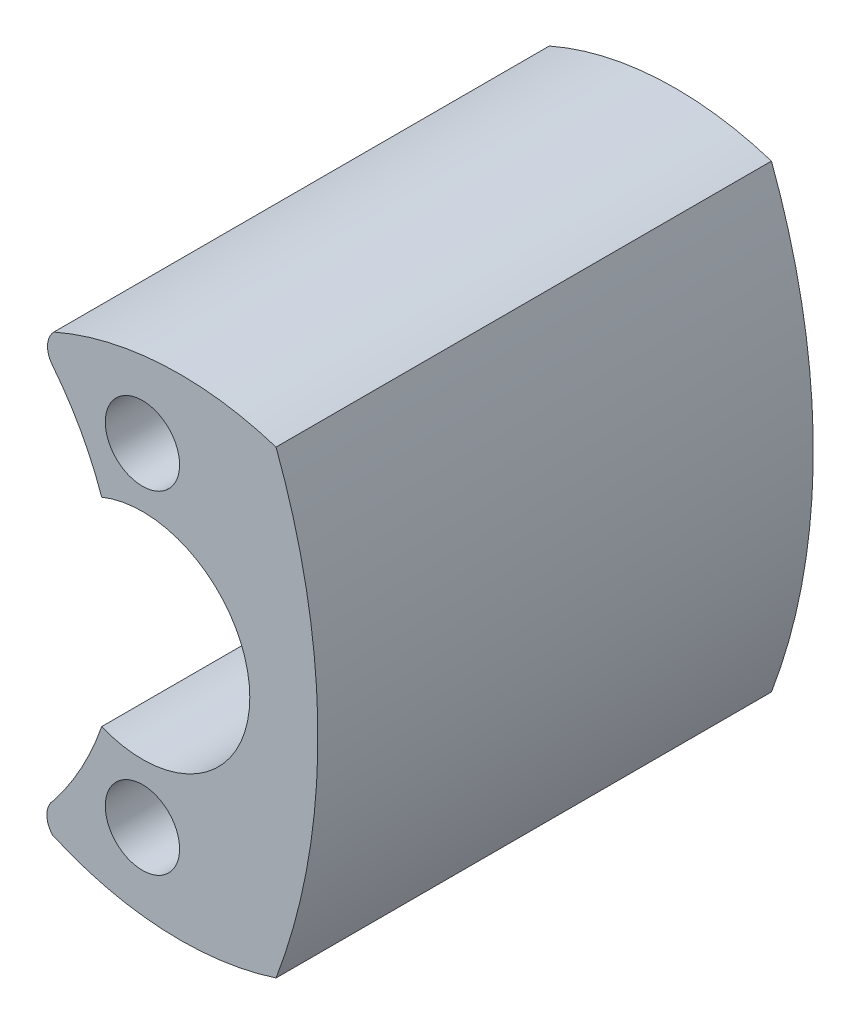
ISO-10303-21;
HEADER;
FILE_DESCRIPTION(('STEP AP214'),'2;1');
FILE_NAME('part.step','',(''),(''),'','','');
FILE_SCHEMA(('AUTOMOTIVE_DESIGN { 1 0 10303 214 1 1 1 1 }'));
ENDSEC;
DATA;
#1=APPLICATION_CONTEXT('core data for automotive mechanical design processes');
#2=APPLICATION_PROTOCOL_DEFINITION('international standard','automotive_design',2000,#1);
#3=PRODUCT_CONTEXT('',#1,'mechanical');
#4=PRODUCT('Part','Part','',(#3));
#5=PRODUCT_RELATED_PRODUCT_CATEGORY('part','',(#4));
#6=PRODUCT_DEFINITION_FORMATION('','',#4);
#7=PRODUCT_DEFINITION_CONTEXT('part definition',#1,'design');
#8=PRODUCT_DEFINITION('design','',#6,#7);
#9=PRODUCT_DEFINITION_SHAPE('','',#8);
#10=(LENGTH_UNIT() NAMED_UNIT(*) SI_UNIT(.MILLI.,.METRE.));
#11=(NAMED_UNIT(*) PLANE_ANGLE_UNIT() SI_UNIT($,.RADIAN.));
#12=(NAMED_UNIT(*) SI_UNIT($,.STERADIAN.) SOLID_ANGLE_UNIT());
#13=UNCERTAINTY_MEASURE_WITH_UNIT(LENGTH_MEASURE(1.E-05),#10,'distance_accuracy_value','');
#14=(GEOMETRIC_REPRESENTATION_CONTEXT(3) GLOBAL_UNCERTAINTY_ASSIGNED_CONTEXT((#13)) GLOBAL_UNIT_ASSIGNED_CONTEXT((#10,
#11,#12)) REPRESENTATION_CONTEXT('',''));
#15=CARTESIAN_POINT('',(0.,0.,0.));
#16=DIRECTION('',(0.,0.,1.));
#17=DIRECTION('',(1.,0.,0.));
#18=AXIS2_PLACEMENT_3D('',#15,#16,#17);
#19=CARTESIAN_POINT('',(-13.2313355478784,0.,20.));
#20=DIRECTION('',(0.,0.,-1.));
#21=DIRECTION('',(-1.,0.,0.));
#22=AXIS2_PLACEMENT_3D('',#19,#20,#21);
#23=CYLINDRICAL_SURFACE('',#22,12.2604861513936);
#24=CARTESIAN_POINT('',(-13.2313355478784,0.,20.));
#25=DIRECTION('',(0.,0.,-1.));
#26=DIRECTION('',(-1.,0.,0.));
#27=AXIS2_PLACEMENT_3D('',#24,#25,#26);
#28=CIRCLE('',#27,12.2604861513936);
#29=CARTESIAN_POINT('',(-1.64537225114125,-4.01060782864323,20.));
#30=VERTEX_POINT('',#29);
#31=CARTESIAN_POINT('',(-3.57576767996249,-7.55576136577806,20.));
#32=VERTEX_POINT('',#31);
#33=EDGE_CURVE('E125',#30,#32,#28,.T.);
#34=ORIENTED_EDGE('',*,*,#33,.F.);
#35=DIRECTION('',(0.,0.,-1.));
#36=VECTOR('',#35,1.);
#37=CARTESIAN_POINT('',(-1.64537225114125,-4.01060782864323,11.999));
#38=LINE('',#37,#36);
#39=CARTESIAN_POINT('',(-1.64537225114125,-4.01060782864323,-0.001));
#40=VERTEX_POINT('',#39);
#41=EDGE_CURVE('E112',#30,#40,#38,.T.);
#42=ORIENTED_EDGE('',*,*,#41,.T.);
#43=CARTESIAN_POINT('',(-13.2313355478784,0.,-0.001));
#44=DIRECTION('',(0.,0.,-1.));
#45=DIRECTION('',(-1.,0.,0.));
#46=AXIS2_PLACEMENT_3D('',#43,#44,#45);
#47=CIRCLE('',#46,12.2604861513936);
#48=CARTESIAN_POINT('',(-3.57576767996249,-7.55576136577806,-0.001));
#49=VERTEX_POINT('',#48);
#50=EDGE_CURVE('E123',#40,#49,#47,.T.);
#51=ORIENTED_EDGE('',*,*,#50,.T.);
#52=DIRECTION('',(0.,0.,-1.));
#53=VECTOR('',#52,1.);
#54=CARTESIAN_POINT('',(-3.57576767996249,-7.55576136577806,20.));
#55=LINE('',#54,#53);
#56=EDGE_CURVE('E167',#32,#49,#55,.T.);
#57=ORIENTED_EDGE('',*,*,#56,.F.);
#58=EDGE_LOOP('',(#34,#42,#51,#57));
#59=FACE_BOUND('',#58,.T.);
#60=ADVANCED_FACE('F47',(#59),#23,.F.);
#61=CARTESIAN_POINT('',(1.51645658150854,-2.74018411875687,20.));
#62=DIRECTION('',(0.,0.,-1.));
#63=DIRECTION('',(-1.,0.,0.));
#64=AXIS2_PLACEMENT_3D('',#61,#62,#63);
#65=CYLINDRICAL_SURFACE('',#64,12.6318125052895);
#66=DIRECTION('',(0.,0.,-1.));
#67=VECTOR('',#66,1.);
#68=CARTESIAN_POINT('',(5.39429470920508,9.28167341758802,20.));
#69=LINE('',#68,#67);
#70=CARTESIAN_POINT('',(5.39429470920508,9.28167341758802,20.));
#71=VERTEX_POINT('',#70);
#72=CARTESIAN_POINT('',(5.39429470920508,9.28167341758802,-0.001));
#73=VERTEX_POINT('',#72);
#74=EDGE_CURVE('E161',#71,#73,#69,.T.);
#75=ORIENTED_EDGE('',*,*,#74,.T.);
#76=CARTESIAN_POINT('',(1.51645658150854,-2.74018411875687,-0.001));
#77=DIRECTION('',(0.,0.,1.));
#78=DIRECTION('',(-1.,0.,0.));
#79=AXIS2_PLACEMENT_3D('',#76,#77,#78);
#80=CIRCLE('',#79,12.6318125052895);
#81=CARTESIAN_POINT('',(-3.57576767996249,8.81974404882597,-0.001));
#82=VERTEX_POINT('',#81);
#83=EDGE_CURVE('E138',#73,#82,#80,.T.);
#84=ORIENTED_EDGE('',*,*,#83,.T.);
#85=DIRECTION('',(0.,0.,-1.));
#86=VECTOR('',#85,1.);
#87=CARTESIAN_POINT('',(-3.57576767996249,8.81974404882597,20.));
#88=LINE('',#87,#86);
#89=CARTESIAN_POINT('',(-3.57576767996249,8.81974404882597,20.));
#90=VERTEX_POINT('',#89);
#91=EDGE_CURVE('E11',#90,#82,#88,.T.);
#92=ORIENTED_EDGE('',*,*,#91,.F.);
#93=CARTESIAN_POINT('',(1.51645658150854,-2.74018411875687,20.));
#94=DIRECTION('',(0.,0.,1.));
#95=DIRECTION('',(-1.,0.,0.));
#96=AXIS2_PLACEMENT_3D('',#93,#94,#95);
#97=CIRCLE('',#96,12.6318125052895);
#98=EDGE_CURVE('E149',#71,#90,#97,.T.);
#99=ORIENTED_EDGE('',*,*,#98,.F.);
#100=EDGE_LOOP('',(#75,#84,#92,#99));
#101=FACE_BOUND('',#100,.T.);
#102=ADVANCED_FACE('F49',(#101),#65,.T.);
#103=CARTESIAN_POINT('',(-2.93942531431104,8.19213389498871,20.));
#104=DIRECTION('',(0.,0.,-1.));
#105=DIRECTION('',(-1.,0.,0.));
#106=AXIS2_PLACEMENT_3D('',#103,#104,#105);
#107=CYLINDRICAL_SURFACE('',#106,0.893770726485547);
#108=ORIENTED_EDGE('',*,*,#91,.T.);
#109=CARTESIAN_POINT('',(-2.93942531431104,8.19213389498871,-0.001));
#110=DIRECTION('',(0.,0.,1.));
#111=DIRECTION('',(-1.,0.,0.));
#112=AXIS2_PLACEMENT_3D('',#109,#110,#111);
#113=CIRCLE('',#112,0.893770726485547);
#114=CARTESIAN_POINT('',(-3.63871286599695,7.63551640372596,-0.001));
#115=VERTEX_POINT('',#114);
#116=EDGE_CURVE('E135',#82,#115,#113,.T.);
#117=ORIENTED_EDGE('',*,*,#116,.T.);
#118=DIRECTION('',(0.,0.,-1.));
#119=VECTOR('',#118,1.);
#120=CARTESIAN_POINT('',(-3.63871286599695,7.63551640372596,20.));
#121=LINE('',#120,#119);
#122=CARTESIAN_POINT('',(-3.63871286599695,7.63551640372596,20.));
#123=VERTEX_POINT('',#122);
#124=EDGE_CURVE('E55',#123,#115,#121,.T.);
#125=ORIENTED_EDGE('',*,*,#124,.F.);
#126=CARTESIAN_POINT('',(-2.93942531431104,8.19213389498871,20.));
#127=DIRECTION('',(0.,0.,1.));
#128=DIRECTION('',(-1.,0.,0.));
#129=AXIS2_PLACEMENT_3D('',#126,#127,#128);
#130=CIRCLE('',#129,0.893770726485547);
#131=EDGE_CURVE('E151',#90,#123,#130,.T.);
#132=ORIENTED_EDGE('',*,*,#131,.F.);
#133=EDGE_LOOP('',(#108,#117,#125,#132));
#134=FACE_BOUND('',#133,.T.);
#135=ADVANCED_FACE('F176',(#134),#107,.T.);
#136=CARTESIAN_POINT('',(-1.64537225114125,4.01060782864323,-0.00100000000000088));
#137=VERTEX_POINT('',#136);
#138=EDGE_CURVE('E134',#115,#137,#47,.T.);
#139=ORIENTED_EDGE('',*,*,#138,.T.);
#140=DIRECTION('',(0.,0.,-1.));
#141=VECTOR('',#140,1.);
#142=CARTESIAN_POINT('',(-1.64537225114125,4.01060782864323,11.999));
#143=LINE('',#142,#141);
#144=CARTESIAN_POINT('',(-1.64537225114125,4.01060782864323,20.));
#145=VERTEX_POINT('',#144);
#146=EDGE_CURVE('E62',#137,#145,#143,.F.);
#147=ORIENTED_EDGE('',*,*,#146,.T.);
#148=EDGE_CURVE('E153',#123,#145,#28,.T.);
#149=ORIENTED_EDGE('',*,*,#148,.F.);
#150=ORIENTED_EDGE('',*,*,#124,.T.);
#151=EDGE_LOOP('',(#139,#147,#149,#150));
#152=FACE_BOUND('',#151,.T.);
#153=ADVANCED_FACE('F171',(#152),#23,.F.);
#154=CARTESIAN_POINT('',(-2.97974763085371,-8.20163469798779,20.));
#155=DIRECTION('',(0.,0.,-1.));
#156=DIRECTION('',(-1.,0.,0.));
#157=AXIS2_PLACEMENT_3D('',#154,#155,#156);
#158=CYLINDRICAL_SURFACE('',#157,0.878858498393984);
#159=ORIENTED_EDGE('',*,*,#56,.T.);
#160=CARTESIAN_POINT('',(-2.97974763085371,-8.20163469798779,-0.001));
#161=DIRECTION('',(0.,0.,1.));
#162=DIRECTION('',(1.,0.,0.));
#163=AXIS2_PLACEMENT_3D('',#160,#161,#162);
#164=CIRCLE('',#163,0.878858498393984);
#165=CARTESIAN_POINT('',(-3.62562096306344,-8.79765474709655,-0.001));
#166=VERTEX_POINT('',#165);
#167=EDGE_CURVE('E133',#49,#166,#164,.T.);
#168=ORIENTED_EDGE('',*,*,#167,.T.);
#169=DIRECTION('',(0.,0.,-1.));
#170=VECTOR('',#169,1.);
#171=CARTESIAN_POINT('',(-3.62562096306344,-8.79765474709655,20.));
#172=LINE('',#171,#170);
#173=CARTESIAN_POINT('',(-3.62562096306344,-8.79765474709655,20.));
#174=VERTEX_POINT('',#173);
#175=EDGE_CURVE('E165',#174,#166,#172,.T.);
#176=ORIENTED_EDGE('',*,*,#175,.F.);
#177=CARTESIAN_POINT('',(-2.97974763085371,-8.20163469798779,20.));
#178=DIRECTION('',(0.,0.,1.));
#179=DIRECTION('',(1.,0.,0.));
#180=AXIS2_PLACEMENT_3D('',#177,#178,#179);
#181=CIRCLE('',#180,0.878858498393984);
#182=EDGE_CURVE('E156',#32,#174,#181,.T.);
#183=ORIENTED_EDGE('',*,*,#182,.F.);
#184=EDGE_LOOP('',(#159,#168,#176,#183));
#185=FACE_BOUND('',#184,.T.);
#186=ADVANCED_FACE('F198',(#185),#158,.T.);
#187=CARTESIAN_POINT('',(1.51645658150854,2.74018411875671,20.));
#188=DIRECTION('',(0.,0.,-1.));
#189=DIRECTION('',(-1.,0.,0.));
#190=AXIS2_PLACEMENT_3D('',#187,#188,#189);
#191=CYLINDRICAL_SURFACE('',#190,12.6318125052894);
#192=ORIENTED_EDGE('',*,*,#175,.T.);
#193=CARTESIAN_POINT('',(1.51645658150854,2.74018411875671,-0.001));
#194=DIRECTION('',(0.,0.,1.));
#195=DIRECTION('',(1.,0.,0.));
#196=AXIS2_PLACEMENT_3D('',#193,#194,#195);
#197=CIRCLE('',#196,12.6318125052894);
#198=CARTESIAN_POINT('',(5.39429470920509,-9.28167341758802,-0.001));
#199=VERTEX_POINT('',#198);
#200=EDGE_CURVE('E143',#166,#199,#197,.T.);
#201=ORIENTED_EDGE('',*,*,#200,.T.);
#202=DIRECTION('',(0.,0.,-1.));
#203=VECTOR('',#202,1.);
#204=CARTESIAN_POINT('',(5.39429470920509,-9.28167341758802,20.));
#205=LINE('',#204,#203);
#206=CARTESIAN_POINT('',(5.39429470920509,-9.28167341758802,20.));
#207=VERTEX_POINT('',#206);
#208=EDGE_CURVE('E163',#207,#199,#205,.T.);
#209=ORIENTED_EDGE('',*,*,#208,.F.);
#210=CARTESIAN_POINT('',(1.51645658150854,2.74018411875671,20.));
#211=DIRECTION('',(0.,0.,1.));
#212=DIRECTION('',(1.,0.,0.));
#213=AXIS2_PLACEMENT_3D('',#210,#211,#212);
#214=CIRCLE('',#213,12.6318125052894);
#215=EDGE_CURVE('E158',#174,#207,#214,.T.);
#216=ORIENTED_EDGE('',*,*,#215,.F.);
#217=EDGE_LOOP('',(#192,#201,#209,#216));
#218=FACE_BOUND('',#217,.T.);
#219=ADVANCED_FACE('F202',(#218),#191,.T.);
#220=CARTESIAN_POINT('',(-19.2656664170293,0.,20.));
#221=DIRECTION('',(0.,0.,-1.));
#222=DIRECTION('',(-1.,0.,0.));
#223=AXIS2_PLACEMENT_3D('',#220,#221,#222);
#224=CYLINDRICAL_SURFACE('',#223,26.3488736794981);
#225=ORIENTED_EDGE('',*,*,#208,.T.);
#226=CARTESIAN_POINT('',(-19.2656664170293,0.,-0.001));
#227=DIRECTION('',(0.,0.,1.));
#228=DIRECTION('',(-1.,0.,0.));
#229=AXIS2_PLACEMENT_3D('',#226,#227,#228);
#230=CIRCLE('',#229,26.3488736794981);
#231=EDGE_CURVE('E146',#199,#73,#230,.T.);
#232=ORIENTED_EDGE('',*,*,#231,.T.);
#233=ORIENTED_EDGE('',*,*,#74,.F.);
#234=CARTESIAN_POINT('',(-19.2656664170293,0.,20.));
#235=DIRECTION('',(0.,0.,1.));
#236=DIRECTION('',(-1.,0.,0.));
#237=AXIS2_PLACEMENT_3D('',#234,#235,#236);
#238=CIRCLE('',#237,26.3488736794981);
#239=EDGE_CURVE('E70',#207,#71,#238,.T.);
#240=ORIENTED_EDGE('',*,*,#239,.F.);
#241=EDGE_LOOP('',(#225,#232,#233,#240));
#242=FACE_BOUND('',#241,.T.);
#243=ADVANCED_FACE('F204',(#242),#224,.T.);
#244=CARTESIAN_POINT('',(-8.87460491776037,-1.37009205937844,20.));
#245=DIRECTION('',(0.,0.,-1.));
#246=DIRECTION('',(-1.,0.,0.));
#247=AXIS2_PLACEMENT_3D('',#244,#245,#246);
#248=PLANE('',#247);
#249=CARTESIAN_POINT('',(0.,-6.715,20.));
#250=DIRECTION('',(0.,0.,1.));
#251=DIRECTION('',(-1.,0.,0.));
#252=AXIS2_PLACEMENT_3D('',#249,#250,#251);
#253=CIRCLE('',#252,1.5);
#254=CARTESIAN_POINT('',(-1.5,-6.715,20.));
#255=VERTEX_POINT('',#254);
#256=EDGE_CURVE('E126',#255,#255,#253,.T.);
#257=ORIENTED_EDGE('',*,*,#256,.F.);
#258=EDGE_LOOP('',(#257));
#259=FACE_BOUND('',#258,.T.);
#260=CARTESIAN_POINT('',(0.,6.715,20.));
#261=DIRECTION('',(0.,0.,1.));
#262=DIRECTION('',(1.,0.,0.));
#263=AXIS2_PLACEMENT_3D('',#260,#261,#262);
#264=CIRCLE('',#263,1.5);
#265=CARTESIAN_POINT('',(1.5,6.715,20.));
#266=VERTEX_POINT('',#265);
#267=EDGE_CURVE('E183',#266,#266,#264,.T.);
#268=ORIENTED_EDGE('',*,*,#267,.F.);
#269=EDGE_LOOP('',(#268));
#270=FACE_BOUND('',#269,.T.);
#271=ORIENTED_EDGE('',*,*,#148,.T.);
#272=CARTESIAN_POINT('',(0.,0.,20.));
#273=DIRECTION('',(0.,0.,-1.));
#274=DIRECTION('',(-1.,0.,0.));
#275=AXIS2_PLACEMENT_3D('',#272,#273,#274);
#276=CIRCLE('',#275,4.335);
#277=EDGE_CURVE('E118',#145,#30,#276,.T.);
#278=ORIENTED_EDGE('',*,*,#277,.T.);
#279=ORIENTED_EDGE('',*,*,#33,.T.);
#280=ORIENTED_EDGE('',*,*,#182,.T.);
#281=ORIENTED_EDGE('',*,*,#215,.T.);
#282=ORIENTED_EDGE('',*,*,#239,.T.);
#283=ORIENTED_EDGE('',*,*,#98,.T.);
#284=ORIENTED_EDGE('',*,*,#131,.T.);
#285=EDGE_LOOP('',(#271,#278,#279,#280,#281,#282,#283,#284));
#286=FACE_BOUND('',#285,.T.);
#287=ADVANCED_FACE('F194',(#259,#270,#286),#248,.F.);
#288=CARTESIAN_POINT('',(-8.87460491776037,-1.37009205937844,-0.001));
#289=DIRECTION('',(0.,0.,-1.));
#290=DIRECTION('',(-1.,0.,0.));
#291=AXIS2_PLACEMENT_3D('',#288,#289,#290);
#292=PLANE('',#291);
#293=CARTESIAN_POINT('',(0.,0.,-0.001));
#294=DIRECTION('',(0.,0.,-1.));
#295=DIRECTION('',(-1.,0.,0.));
#296=AXIS2_PLACEMENT_3D('',#293,#294,#295);
#297=CIRCLE('',#296,4.335);
#298=EDGE_CURVE('E109',#137,#40,#297,.T.);
#299=ORIENTED_EDGE('',*,*,#298,.F.);
#300=ORIENTED_EDGE('',*,*,#138,.F.);
#301=ORIENTED_EDGE('',*,*,#116,.F.);
#302=ORIENTED_EDGE('',*,*,#83,.F.);
#303=ORIENTED_EDGE('',*,*,#231,.F.);
#304=ORIENTED_EDGE('',*,*,#200,.F.);
#305=ORIENTED_EDGE('',*,*,#167,.F.);
#306=ORIENTED_EDGE('',*,*,#50,.F.);
#307=EDGE_LOOP('',(#299,#300,#301,#302,#303,#304,#305,#306));
#308=FACE_BOUND('',#307,.T.);
#309=CARTESIAN_POINT('',(0.,-6.715,-0.001000000000001));
#310=DIRECTION('',(0.,0.,1.));
#311=DIRECTION('',(-1.,0.,0.));
#312=AXIS2_PLACEMENT_3D('',#309,#310,#311);
#313=CIRCLE('',#312,1.5);
#314=CARTESIAN_POINT('',(-1.5,-6.715,-0.001000000000001));
#315=VERTEX_POINT('',#314);
#316=EDGE_CURVE('E187',#315,#315,#313,.T.);
#317=ORIENTED_EDGE('',*,*,#316,.T.);
#318=EDGE_LOOP('',(#317));
#319=FACE_BOUND('',#318,.T.);
#320=CARTESIAN_POINT('',(0.,6.715,-0.001000000000001));
#321=DIRECTION('',(0.,0.,1.));
#322=DIRECTION('',(1.,0.,0.));
#323=AXIS2_PLACEMENT_3D('',#320,#321,#322);
#324=CIRCLE('',#323,1.5);
#325=CARTESIAN_POINT('',(1.5,6.715,-0.001000000000001));
#326=VERTEX_POINT('',#325);
#327=EDGE_CURVE('E181',#326,#326,#324,.T.);
#328=ORIENTED_EDGE('',*,*,#327,.T.);
#329=EDGE_LOOP('',(#328));
#330=FACE_BOUND('',#329,.T.);
#331=ADVANCED_FACE('F129',(#308,#319,#330),#292,.T.);
#332=CARTESIAN_POINT('',(0.,6.715,-0.001000000000001));
#333=DIRECTION('',(0.,0.,1.));
#334=DIRECTION('',(1.,0.,0.));
#335=AXIS2_PLACEMENT_3D('',#332,#333,#334);
#336=CYLINDRICAL_SURFACE('',#335,1.5);
#337=ORIENTED_EDGE('',*,*,#327,.F.);
#338=EDGE_LOOP('',(#337));
#339=FACE_BOUND('',#338,.T.);
#340=ORIENTED_EDGE('',*,*,#267,.T.);
#341=EDGE_LOOP('',(#340));
#342=FACE_BOUND('',#341,.T.);
#343=ADVANCED_FACE('F275',(#339,#342),#336,.F.);
#344=CARTESIAN_POINT('',(0.,-6.715,-0.001000000000001));
#345=DIRECTION('',(0.,0.,1.));
#346=DIRECTION('',(1.,0.,0.));
#347=AXIS2_PLACEMENT_3D('',#344,#345,#346);
#348=CYLINDRICAL_SURFACE('',#347,1.5);
#349=ORIENTED_EDGE('',*,*,#316,.F.);
#350=EDGE_LOOP('',(#349));
#351=FACE_BOUND('',#350,.T.);
#352=ORIENTED_EDGE('',*,*,#256,.T.);
#353=EDGE_LOOP('',(#352));
#354=FACE_BOUND('',#353,.T.);
#355=ADVANCED_FACE('F245',(#351,#354),#348,.F.);
#356=CARTESIAN_POINT('',(0.,0.,23.999));
#357=DIRECTION('',(0.,0.,-1.));
#358=DIRECTION('',(-1.,0.,0.));
#359=AXIS2_PLACEMENT_3D('',#356,#357,#358);
#360=CYLINDRICAL_SURFACE('',#359,4.335);
#361=ORIENTED_EDGE('',*,*,#277,.F.);
#362=ORIENTED_EDGE('',*,*,#146,.F.);
#363=ORIENTED_EDGE('',*,*,#298,.T.);
#364=ORIENTED_EDGE('',*,*,#41,.F.);
#365=EDGE_LOOP('',(#361,#362,#363,#364));
#366=FACE_BOUND('',#365,.T.);
#367=ADVANCED_FACE('F111',(#366),#360,.F.);
#368=CLOSED_SHELL('',(#60,#102,#135,#153,#186,#219,#243,#287,#331,#343,#355,#367));
#369=MANIFOLD_SOLID_BREP('B2',#368);
#370=ADVANCED_BREP_SHAPE_REPRESENTATION('',(#18,#369),#14);
#371=SHAPE_DEFINITION_REPRESENTATION(#9,#370);
ENDSEC;
END-ISO-10303-21;
